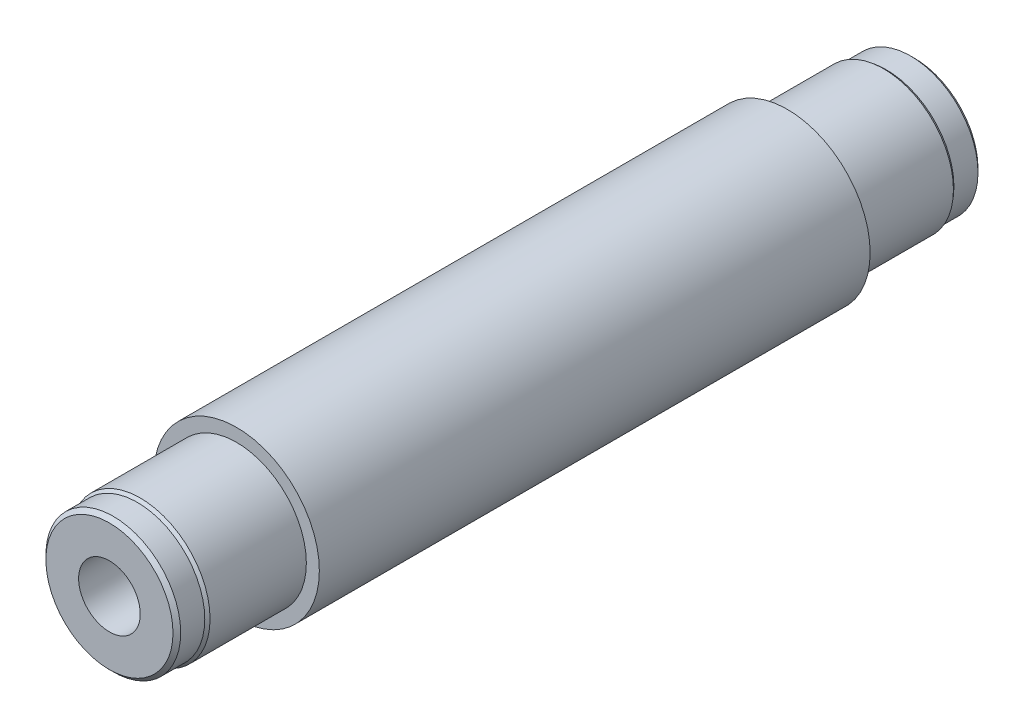
ISO-10303-21;
HEADER;
FILE_DESCRIPTION(('STEP AP214'),'2;1');
FILE_NAME('part.step','',(''),(''),'','','');
FILE_SCHEMA(('AUTOMOTIVE_DESIGN { 1 0 10303 214 1 1 1 1 }'));
ENDSEC;
DATA;
#1=APPLICATION_CONTEXT('core data for automotive mechanical design processes');
#2=APPLICATION_PROTOCOL_DEFINITION('international standard','automotive_design',2000,#1);
#3=PRODUCT_CONTEXT('',#1,'mechanical');
#4=PRODUCT('Part','Part','',(#3));
#5=PRODUCT_RELATED_PRODUCT_CATEGORY('part','',(#4));
#6=PRODUCT_DEFINITION_FORMATION('','',#4);
#7=PRODUCT_DEFINITION_CONTEXT('part definition',#1,'design');
#8=PRODUCT_DEFINITION('design','',#6,#7);
#9=PRODUCT_DEFINITION_SHAPE('','',#8);
#10=(LENGTH_UNIT() NAMED_UNIT(*) SI_UNIT(.MILLI.,.METRE.));
#11=(NAMED_UNIT(*) PLANE_ANGLE_UNIT() SI_UNIT($,.RADIAN.));
#12=(NAMED_UNIT(*) SI_UNIT($,.STERADIAN.) SOLID_ANGLE_UNIT());
#13=UNCERTAINTY_MEASURE_WITH_UNIT(LENGTH_MEASURE(1.E-05),#10,'distance_accuracy_value','');
#14=(GEOMETRIC_REPRESENTATION_CONTEXT(3) GLOBAL_UNCERTAINTY_ASSIGNED_CONTEXT((#13)) GLOBAL_UNIT_ASSIGNED_CONTEXT((#10,
#11,#12)) REPRESENTATION_CONTEXT('',''));
#15=CARTESIAN_POINT('',(0.,0.,0.));
#16=DIRECTION('',(0.,0.,1.));
#17=DIRECTION('',(1.,0.,0.));
#18=AXIS2_PLACEMENT_3D('',#15,#16,#17);
#19=CARTESIAN_POINT('',(0.,0.,19.3));
#20=DIRECTION('',(0.,0.,-1.));
#21=DIRECTION('',(1.,0.,0.));
#22=AXIS2_PLACEMENT_3D('',#19,#20,#21);
#23=CONICAL_SURFACE('',#22,3.625,0.694738276197);
#24=DIRECTION('',(-0.640184399664382,0.,0.768221279597458));
#25=VECTOR('',#24,1.);
#26=CARTESIAN_POINT('',(3.625,0.,19.3));
#27=LINE('',#26,#25);
#28=CARTESIAN_POINT('',(3.625,0.,19.3));
#29=VERTEX_POINT('',#28);
#30=CARTESIAN_POINT('',(3.5,0.,19.45));
#31=VERTEX_POINT('',#30);
#32=EDGE_CURVE('E9',#29,#31,#27,.T.);
#33=ORIENTED_EDGE('',*,*,#32,.F.);
#34=CARTESIAN_POINT('',(0.,0.,19.3));
#35=DIRECTION('',(0.,0.,-1.));
#36=DIRECTION('',(1.,0.,0.));
#37=AXIS2_PLACEMENT_3D('',#34,#35,#36);
#38=CIRCLE('',#37,3.625);
#39=EDGE_CURVE('E125',#29,#29,#38,.T.);
#40=ORIENTED_EDGE('',*,*,#39,.F.);
#41=ORIENTED_EDGE('',*,*,#32,.T.);
#42=CARTESIAN_POINT('',(0.,0.,19.45));
#43=DIRECTION('',(0.,0.,-1.));
#44=DIRECTION('',(1.,0.,0.));
#45=AXIS2_PLACEMENT_3D('',#42,#43,#44);
#46=CIRCLE('',#45,3.5);
#47=EDGE_CURVE('E25',#31,#31,#46,.T.);
#48=ORIENTED_EDGE('',*,*,#47,.T.);
#49=EDGE_LOOP('',(#33,#40,#41,#48));
#50=FACE_BOUND('',#49,.T.);
#51=ADVANCED_FACE('F14',(#50),#23,.T.);
#52=CARTESIAN_POINT('',(0.,0.,-20.9));
#53=DIRECTION('',(0.,0.,1.));
#54=DIRECTION('',(1.,0.,0.));
#55=AXIS2_PLACEMENT_3D('',#52,#53,#54);
#56=CYLINDRICAL_SURFACE('',#55,3.5);
#57=DIRECTION('',(0.,0.,1.));
#58=VECTOR('',#57,1.);
#59=CARTESIAN_POINT('',(3.5,0.,-20.9));
#60=LINE('',#59,#58);
#61=CARTESIAN_POINT('',(3.5,0.,20.7));
#62=VERTEX_POINT('',#61);
#63=EDGE_CURVE('E76',#31,#62,#60,.T.);
#64=ORIENTED_EDGE('',*,*,#63,.T.);
#65=CARTESIAN_POINT('',(0.,0.,20.7));
#66=DIRECTION('',(0.,0.,-1.));
#67=DIRECTION('',(1.,0.,0.));
#68=AXIS2_PLACEMENT_3D('',#65,#66,#67);
#69=CIRCLE('',#68,3.5);
#70=EDGE_CURVE('E122',#62,#62,#69,.T.);
#71=ORIENTED_EDGE('',*,*,#70,.T.);
#72=ORIENTED_EDGE('',*,*,#63,.F.);
#73=ORIENTED_EDGE('',*,*,#47,.F.);
#74=EDGE_LOOP('',(#64,#71,#72,#73));
#75=FACE_BOUND('',#74,.T.);
#76=ADVANCED_FACE('F213',(#75),#56,.T.);
#77=CARTESIAN_POINT('',(0.,0.,-19.3));
#78=DIRECTION('',(0.,0.,1.));
#79=DIRECTION('',(1.,0.,0.));
#80=AXIS2_PLACEMENT_3D('',#77,#78,#79);
#81=CYLINDRICAL_SURFACE('',#80,3.625);
#82=CARTESIAN_POINT('',(0.,0.,14.3));
#83=DIRECTION('',(0.,0.,-1.));
#84=DIRECTION('',(1.,0.,0.));
#85=AXIS2_PLACEMENT_3D('',#82,#83,#84);
#86=CIRCLE('',#85,3.625);
#87=CARTESIAN_POINT('',(3.625,0.,14.3));
#88=VERTEX_POINT('',#87);
#89=EDGE_CURVE('E141',#88,#88,#86,.T.);
#90=ORIENTED_EDGE('',*,*,#89,.F.);
#91=DIRECTION('',(0.,0.,1.));
#92=VECTOR('',#91,1.);
#93=CARTESIAN_POINT('',(3.625,0.,-19.3));
#94=LINE('',#93,#92);
#95=EDGE_CURVE('E87',#88,#29,#94,.T.);
#96=ORIENTED_EDGE('',*,*,#95,.T.);
#97=ORIENTED_EDGE('',*,*,#39,.T.);
#98=ORIENTED_EDGE('',*,*,#95,.F.);
#99=EDGE_LOOP('',(#90,#96,#97,#98));
#100=FACE_BOUND('',#99,.T.);
#101=ADVANCED_FACE('F218',(#100),#81,.T.);
#102=CARTESIAN_POINT('',(0.,0.,20.7));
#103=DIRECTION('',(0.,0.,-1.));
#104=DIRECTION('',(1.,0.,0.));
#105=AXIS2_PLACEMENT_3D('',#102,#103,#104);
#106=CONICAL_SURFACE('',#105,3.5,0.785398163397);
#107=CARTESIAN_POINT('',(0.,0.,20.9));
#108=DIRECTION('',(0.,0.,-1.));
#109=DIRECTION('',(1.,0.,0.));
#110=AXIS2_PLACEMENT_3D('',#107,#108,#109);
#111=CIRCLE('',#110,3.3);
#112=CARTESIAN_POINT('',(3.3,0.,20.9));
#113=VERTEX_POINT('',#112);
#114=EDGE_CURVE('E139',#113,#113,#111,.T.);
#115=ORIENTED_EDGE('',*,*,#114,.T.);
#116=DIRECTION('',(-0.707106781186548,0.,0.707106781186548));
#117=VECTOR('',#116,1.);
#118=CARTESIAN_POINT('',(3.5,0.,20.7));
#119=LINE('',#118,#117);
#120=EDGE_CURVE('E124',#62,#113,#119,.T.);
#121=ORIENTED_EDGE('',*,*,#120,.F.);
#122=ORIENTED_EDGE('',*,*,#70,.F.);
#123=ORIENTED_EDGE('',*,*,#120,.T.);
#124=EDGE_LOOP('',(#115,#121,#122,#123));
#125=FACE_BOUND('',#124,.T.);
#126=ADVANCED_FACE('F222',(#125),#106,.T.);
#127=CARTESIAN_POINT('',(0.,0.,14.3));
#128=DIRECTION('',(0.,0.,1.));
#129=DIRECTION('',(1.,0.,0.));
#130=AXIS2_PLACEMENT_3D('',#127,#128,#129);
#131=PLANE('',#130);
#132=ORIENTED_EDGE('',*,*,#89,.T.);
#133=EDGE_LOOP('',(#132));
#134=FACE_BOUND('',#133,.T.);
#135=CARTESIAN_POINT('',(0.,0.,14.3));
#136=DIRECTION('',(0.,0.,-1.));
#137=DIRECTION('',(1.,0.,0.));
#138=AXIS2_PLACEMENT_3D('',#135,#136,#137);
#139=CIRCLE('',#138,4.3);
#140=CARTESIAN_POINT('',(4.3,0.,14.3));
#141=VERTEX_POINT('',#140);
#142=EDGE_CURVE('E178',#141,#141,#139,.T.);
#143=ORIENTED_EDGE('',*,*,#142,.F.);
#144=EDGE_LOOP('',(#143));
#145=FACE_BOUND('',#144,.T.);
#146=ADVANCED_FACE('F228',(#134,#145),#131,.T.);
#147=CARTESIAN_POINT('',(0.,0.,20.9));
#148=DIRECTION('',(0.,0.,1.));
#149=DIRECTION('',(1.,0.,0.));
#150=AXIS2_PLACEMENT_3D('',#147,#148,#149);
#151=PLANE('',#150);
#152=CARTESIAN_POINT('',(0.,0.,20.9));
#153=DIRECTION('',(0.,0.,-1.));
#154=DIRECTION('',(1.,0.,0.));
#155=AXIS2_PLACEMENT_3D('',#152,#153,#154);
#156=CIRCLE('',#155,1.6);
#157=CARTESIAN_POINT('',(1.6,0.,20.9));
#158=VERTEX_POINT('',#157);
#159=EDGE_CURVE('E151',#158,#158,#156,.T.);
#160=ORIENTED_EDGE('',*,*,#159,.T.);
#161=EDGE_LOOP('',(#160));
#162=FACE_BOUND('',#161,.T.);
#163=ORIENTED_EDGE('',*,*,#114,.F.);
#164=EDGE_LOOP('',(#163));
#165=FACE_BOUND('',#164,.T.);
#166=ADVANCED_FACE('F224',(#162,#165),#151,.T.);
#167=CARTESIAN_POINT('',(0.,0.,-14.3));
#168=DIRECTION('',(0.,0.,1.));
#169=DIRECTION('',(1.,0.,0.));
#170=AXIS2_PLACEMENT_3D('',#167,#168,#169);
#171=CYLINDRICAL_SURFACE('',#170,4.3);
#172=DIRECTION('',(0.,0.,1.));
#173=VECTOR('',#172,1.);
#174=CARTESIAN_POINT('',(4.3,0.,-14.3));
#175=LINE('',#174,#173);
#176=CARTESIAN_POINT('',(4.3,0.,-14.3));
#177=VERTEX_POINT('',#176);
#178=EDGE_CURVE('E150',#177,#141,#175,.T.);
#179=ORIENTED_EDGE('',*,*,#178,.F.);
#180=CARTESIAN_POINT('',(0.,0.,-14.3));
#181=DIRECTION('',(0.,0.,-1.));
#182=DIRECTION('',(1.,0.,0.));
#183=AXIS2_PLACEMENT_3D('',#180,#181,#182);
#184=CIRCLE('',#183,4.3);
#185=EDGE_CURVE('E18',#177,#177,#184,.T.);
#186=ORIENTED_EDGE('',*,*,#185,.F.);
#187=ORIENTED_EDGE('',*,*,#178,.T.);
#188=ORIENTED_EDGE('',*,*,#142,.T.);
#189=EDGE_LOOP('',(#179,#186,#187,#188));
#190=FACE_BOUND('',#189,.T.);
#191=ADVANCED_FACE('F227',(#190),#171,.T.);
#192=CARTESIAN_POINT('',(0.,0.,-21.9));
#193=DIRECTION('',(0.,0.,1.));
#194=DIRECTION('',(1.,0.,0.));
#195=AXIS2_PLACEMENT_3D('',#192,#193,#194);
#196=CYLINDRICAL_SURFACE('',#195,1.6);
#197=ORIENTED_EDGE('',*,*,#159,.F.);
#198=DIRECTION('',(0.,0.,1.));
#199=VECTOR('',#198,1.);
#200=CARTESIAN_POINT('',(1.6,0.,-21.9));
#201=LINE('',#200,#199);
#202=CARTESIAN_POINT('',(1.6,0.,-20.9));
#203=VERTEX_POINT('',#202);
#204=EDGE_CURVE('E147',#203,#158,#201,.T.);
#205=ORIENTED_EDGE('',*,*,#204,.F.);
#206=CARTESIAN_POINT('',(0.,0.,-20.9));
#207=DIRECTION('',(0.,0.,-1.));
#208=DIRECTION('',(1.,0.,0.));
#209=AXIS2_PLACEMENT_3D('',#206,#207,#208);
#210=CIRCLE('',#209,1.6);
#211=EDGE_CURVE('E163',#203,#203,#210,.T.);
#212=ORIENTED_EDGE('',*,*,#211,.T.);
#213=ORIENTED_EDGE('',*,*,#204,.T.);
#214=EDGE_LOOP('',(#197,#205,#212,#213));
#215=FACE_BOUND('',#214,.T.);
#216=ADVANCED_FACE('F230',(#215),#196,.F.);
#217=CARTESIAN_POINT('',(0.,0.,-14.3));
#218=DIRECTION('',(0.,0.,1.));
#219=DIRECTION('',(1.,0.,0.));
#220=AXIS2_PLACEMENT_3D('',#217,#218,#219);
#221=PLANE('',#220);
#222=CARTESIAN_POINT('',(0.,0.,-14.3));
#223=DIRECTION('',(0.,0.,-1.));
#224=DIRECTION('',(1.,0.,0.));
#225=AXIS2_PLACEMENT_3D('',#222,#223,#224);
#226=CIRCLE('',#225,3.625);
#227=CARTESIAN_POINT('',(3.625,0.,-14.3));
#228=VERTEX_POINT('',#227);
#229=EDGE_CURVE('E113',#228,#228,#226,.T.);
#230=ORIENTED_EDGE('',*,*,#229,.F.);
#231=EDGE_LOOP('',(#230));
#232=FACE_BOUND('',#231,.T.);
#233=ORIENTED_EDGE('',*,*,#185,.T.);
#234=EDGE_LOOP('',(#233));
#235=FACE_BOUND('',#234,.T.);
#236=ADVANCED_FACE('F234',(#232,#235),#221,.F.);
#237=CARTESIAN_POINT('',(0.,0.,-20.9));
#238=DIRECTION('',(0.,0.,1.));
#239=DIRECTION('',(1.,0.,0.));
#240=AXIS2_PLACEMENT_3D('',#237,#238,#239);
#241=PLANE('',#240);
#242=ORIENTED_EDGE('',*,*,#211,.F.);
#243=EDGE_LOOP('',(#242));
#244=FACE_BOUND('',#243,.T.);
#245=CARTESIAN_POINT('',(0.,0.,-20.9));
#246=DIRECTION('',(0.,0.,-1.));
#247=DIRECTION('',(1.,0.,0.));
#248=AXIS2_PLACEMENT_3D('',#245,#246,#247);
#249=CIRCLE('',#248,3.3);
#250=CARTESIAN_POINT('',(3.3,0.,-20.9));
#251=VERTEX_POINT('',#250);
#252=EDGE_CURVE('E99',#251,#251,#249,.T.);
#253=ORIENTED_EDGE('',*,*,#252,.T.);
#254=EDGE_LOOP('',(#253));
#255=FACE_BOUND('',#254,.T.);
#256=ADVANCED_FACE('F100',(#244,#255),#241,.F.);
#257=CARTESIAN_POINT('',(0.,0.,-19.3));
#258=DIRECTION('',(0.,0.,1.));
#259=DIRECTION('',(1.,0.,0.));
#260=AXIS2_PLACEMENT_3D('',#257,#258,#259);
#261=CYLINDRICAL_SURFACE('',#260,3.625);
#262=DIRECTION('',(0.,0.,1.));
#263=VECTOR('',#262,1.);
#264=CARTESIAN_POINT('',(3.625,0.,-19.3));
#265=LINE('',#264,#263);
#266=CARTESIAN_POINT('',(3.625,0.,-19.3));
#267=VERTEX_POINT('',#266);
#268=EDGE_CURVE('E105',#267,#228,#265,.T.);
#269=ORIENTED_EDGE('',*,*,#268,.F.);
#270=CARTESIAN_POINT('',(0.,0.,-19.3));
#271=DIRECTION('',(0.,0.,-1.));
#272=DIRECTION('',(1.,0.,0.));
#273=AXIS2_PLACEMENT_3D('',#270,#271,#272);
#274=CIRCLE('',#273,3.625);
#275=EDGE_CURVE('E116',#267,#267,#274,.T.);
#276=ORIENTED_EDGE('',*,*,#275,.F.);
#277=ORIENTED_EDGE('',*,*,#268,.T.);
#278=ORIENTED_EDGE('',*,*,#229,.T.);
#279=EDGE_LOOP('',(#269,#276,#277,#278));
#280=FACE_BOUND('',#279,.T.);
#281=ADVANCED_FACE('F202',(#280),#261,.T.);
#282=CARTESIAN_POINT('',(0.,0.,-20.7));
#283=DIRECTION('',(0.,0.,1.));
#284=DIRECTION('',(1.,0.,0.));
#285=AXIS2_PLACEMENT_3D('',#282,#283,#284);
#286=CONICAL_SURFACE('',#285,3.5,0.785398163397);
#287=DIRECTION('',(-0.707106781186548,0.,-0.707106781186548));
#288=VECTOR('',#287,1.);
#289=CARTESIAN_POINT('',(3.5,0.,-20.7));
#290=LINE('',#289,#288);
#291=CARTESIAN_POINT('',(3.5,0.,-20.7));
#292=VERTEX_POINT('',#291);
#293=EDGE_CURVE('E106',#292,#251,#290,.T.);
#294=ORIENTED_EDGE('',*,*,#293,.F.);
#295=CARTESIAN_POINT('',(0.,0.,-20.7));
#296=DIRECTION('',(0.,0.,-1.));
#297=DIRECTION('',(1.,0.,0.));
#298=AXIS2_PLACEMENT_3D('',#295,#296,#297);
#299=CIRCLE('',#298,3.5);
#300=EDGE_CURVE('E156',#292,#292,#299,.T.);
#301=ORIENTED_EDGE('',*,*,#300,.T.);
#302=ORIENTED_EDGE('',*,*,#293,.T.);
#303=ORIENTED_EDGE('',*,*,#252,.F.);
#304=EDGE_LOOP('',(#294,#301,#302,#303));
#305=FACE_BOUND('',#304,.T.);
#306=ADVANCED_FACE('F16',(#305),#286,.T.);
#307=CARTESIAN_POINT('',(0.,0.,-19.3));
#308=DIRECTION('',(0.,0.,1.));
#309=DIRECTION('',(1.,0.,0.));
#310=AXIS2_PLACEMENT_3D('',#307,#308,#309);
#311=CONICAL_SURFACE('',#310,3.625,0.694738276197);
#312=CARTESIAN_POINT('',(0.,0.,-19.45));
#313=DIRECTION('',(0.,0.,-1.));
#314=DIRECTION('',(1.,0.,0.));
#315=AXIS2_PLACEMENT_3D('',#312,#313,#314);
#316=CIRCLE('',#315,3.5);
#317=CARTESIAN_POINT('',(3.5,0.,-19.45));
#318=VERTEX_POINT('',#317);
#319=EDGE_CURVE('E143',#318,#318,#316,.T.);
#320=ORIENTED_EDGE('',*,*,#319,.F.);
#321=DIRECTION('',(-0.640184399664382,0.,-0.768221279597458));
#322=VECTOR('',#321,1.);
#323=CARTESIAN_POINT('',(3.625,0.,-19.3));
#324=LINE('',#323,#322);
#325=EDGE_CURVE('E154',#267,#318,#324,.T.);
#326=ORIENTED_EDGE('',*,*,#325,.F.);
#327=ORIENTED_EDGE('',*,*,#275,.T.);
#328=ORIENTED_EDGE('',*,*,#325,.T.);
#329=EDGE_LOOP('',(#320,#326,#327,#328));
#330=FACE_BOUND('',#329,.T.);
#331=ADVANCED_FACE('F201',(#330),#311,.T.);
#332=CARTESIAN_POINT('',(0.,0.,-20.9));
#333=DIRECTION('',(0.,0.,1.));
#334=DIRECTION('',(1.,0.,0.));
#335=AXIS2_PLACEMENT_3D('',#332,#333,#334);
#336=CYLINDRICAL_SURFACE('',#335,3.5);
#337=ORIENTED_EDGE('',*,*,#319,.T.);
#338=DIRECTION('',(0.,0.,1.));
#339=VECTOR('',#338,1.);
#340=CARTESIAN_POINT('',(3.5,0.,-20.9));
#341=LINE('',#340,#339);
#342=EDGE_CURVE('E120',#292,#318,#341,.T.);
#343=ORIENTED_EDGE('',*,*,#342,.F.);
#344=ORIENTED_EDGE('',*,*,#300,.F.);
#345=ORIENTED_EDGE('',*,*,#342,.T.);
#346=EDGE_LOOP('',(#337,#343,#344,#345));
#347=FACE_BOUND('',#346,.T.);
#348=ADVANCED_FACE('F197',(#347),#336,.T.);
#349=CLOSED_SHELL('',(#51,#76,#101,#126,#146,#166,#191,#216,#236,#256,#281,#306,#331,#348));
#350=MANIFOLD_SOLID_BREP('B1',#349);
#351=ADVANCED_BREP_SHAPE_REPRESENTATION('',(#18,#350),#14);
#352=SHAPE_DEFINITION_REPRESENTATION(#9,#351);
ENDSEC;
END-ISO-10303-21;
